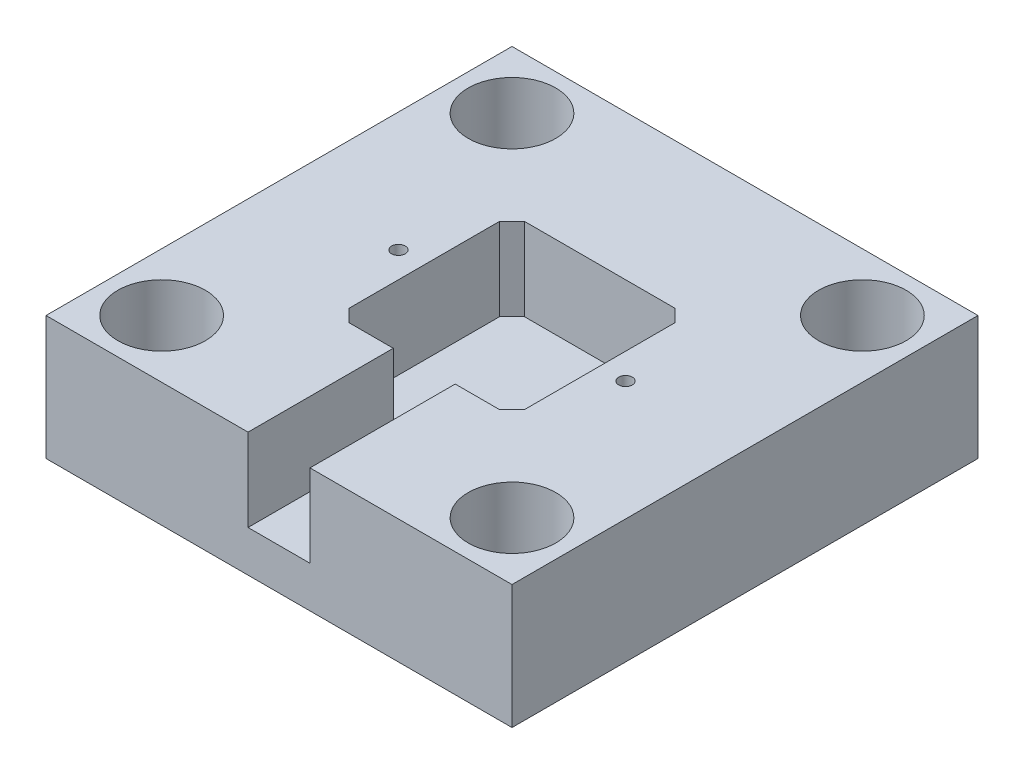
ISO-10303-21;
HEADER;
FILE_DESCRIPTION(('STEP AP214'),'2;1');
FILE_NAME('part.step','',(''),(''),'','','');
FILE_SCHEMA(('AUTOMOTIVE_DESIGN { 1 0 10303 214 1 1 1 1 }'));
ENDSEC;
DATA;
#1=APPLICATION_CONTEXT('core data for automotive mechanical design processes');
#2=APPLICATION_PROTOCOL_DEFINITION('international standard','automotive_design',2000,#1);
#3=PRODUCT_CONTEXT('',#1,'mechanical');
#4=PRODUCT('Part','Part','',(#3));
#5=PRODUCT_RELATED_PRODUCT_CATEGORY('part','',(#4));
#6=PRODUCT_DEFINITION_FORMATION('','',#4);
#7=PRODUCT_DEFINITION_CONTEXT('part definition',#1,'design');
#8=PRODUCT_DEFINITION('design','',#6,#7);
#9=PRODUCT_DEFINITION_SHAPE('','',#8);
#10=(LENGTH_UNIT() NAMED_UNIT(*) SI_UNIT(.MILLI.,.METRE.));
#11=(NAMED_UNIT(*) PLANE_ANGLE_UNIT() SI_UNIT($,.RADIAN.));
#12=(NAMED_UNIT(*) SI_UNIT($,.STERADIAN.) SOLID_ANGLE_UNIT());
#13=UNCERTAINTY_MEASURE_WITH_UNIT(LENGTH_MEASURE(1.E-05),#10,'distance_accuracy_value','');
#14=(GEOMETRIC_REPRESENTATION_CONTEXT(3) GLOBAL_UNCERTAINTY_ASSIGNED_CONTEXT((#13)) GLOBAL_UNIT_ASSIGNED_CONTEXT((#10,
#11,#12)) REPRESENTATION_CONTEXT('',''));
#15=CARTESIAN_POINT('',(0.,0.,0.));
#16=DIRECTION('',(0.,0.,1.));
#17=DIRECTION('',(1.,0.,0.));
#18=AXIS2_PLACEMENT_3D('',#15,#16,#17);
#19=CARTESIAN_POINT('',(0.,125.,0.));
#20=DIRECTION('',(0.,-1.,0.));
#21=DIRECTION('',(0.,0.,-1.));
#22=AXIS2_PLACEMENT_3D('',#19,#20,#21);
#23=PLANE('',#22);
#24=CARTESIAN_POINT('',(-27.5,125.,0.));
#25=DIRECTION('',(0.,-1.,0.));
#26=DIRECTION('',(0.,0.,-1.));
#27=AXIS2_PLACEMENT_3D('',#24,#25,#26);
#28=CIRCLE('',#27,1.65);
#29=CARTESIAN_POINT('',(-27.5,125.,-1.65));
#30=VERTEX_POINT('',#29);
#31=EDGE_CURVE('E272',#30,#30,#28,.T.);
#32=ORIENTED_EDGE('',*,*,#31,.T.);
#33=EDGE_LOOP('',(#32));
#34=FACE_BOUND('',#33,.T.);
#35=CARTESIAN_POINT('',(27.5,125.,0.));
#36=DIRECTION('',(0.,-1.,0.));
#37=DIRECTION('',(0.,0.,-1.));
#38=AXIS2_PLACEMENT_3D('',#35,#36,#37);
#39=CIRCLE('',#38,1.65);
#40=CARTESIAN_POINT('',(27.5,125.,-1.65));
#41=VERTEX_POINT('',#40);
#42=EDGE_CURVE('E269',#41,#41,#39,.T.);
#43=ORIENTED_EDGE('',*,*,#42,.T.);
#44=EDGE_LOOP('',(#43));
#45=FACE_BOUND('',#44,.T.);
#46=DIRECTION('',(1.,0.,0.));
#47=VECTOR('',#46,1.);
#48=CARTESIAN_POINT('',(0.,125.,21.25));
#49=LINE('',#48,#47);
#50=CARTESIAN_POINT('',(7.5,125.,21.25));
#51=VERTEX_POINT('',#50);
#52=CARTESIAN_POINT('',(18.25,125.,21.25));
#53=VERTEX_POINT('',#52);
#54=EDGE_CURVE('E196',#51,#53,#49,.T.);
#55=ORIENTED_EDGE('',*,*,#54,.F.);
#56=DIRECTION('',(0.,0.,-1.));
#57=VECTOR('',#56,1.);
#58=CARTESIAN_POINT('',(7.49999999999999,125.,0.));
#59=LINE('',#58,#57);
#60=CARTESIAN_POINT('',(7.5,125.,56.4264068711928));
#61=VERTEX_POINT('',#60);
#62=EDGE_CURVE('E198',#61,#51,#59,.T.);
#63=ORIENTED_EDGE('',*,*,#62,.F.);
#64=DIRECTION('',(1.,0.,0.));
#65=VECTOR('',#64,1.);
#66=CARTESIAN_POINT('',(-56.4264068711929,125.,56.4264068711928));
#67=LINE('',#66,#65);
#68=CARTESIAN_POINT('',(56.4264068711928,125.,56.4264068711928));
#69=VERTEX_POINT('',#68);
#70=EDGE_CURVE('E242',#61,#69,#67,.T.);
#71=ORIENTED_EDGE('',*,*,#70,.T.);
#72=DIRECTION('',(0.,0.,-1.));
#73=VECTOR('',#72,1.);
#74=CARTESIAN_POINT('',(56.4264068711928,125.,-56.4264068711928));
#75=LINE('',#74,#73);
#76=CARTESIAN_POINT('',(56.4264068711928,125.,-56.4264068711928));
#77=VERTEX_POINT('',#76);
#78=EDGE_CURVE('E241',#69,#77,#75,.T.);
#79=ORIENTED_EDGE('',*,*,#78,.T.);
#80=DIRECTION('',(-1.,0.,0.));
#81=VECTOR('',#80,1.);
#82=CARTESIAN_POINT('',(-56.4264068711929,125.,-56.4264068711928));
#83=LINE('',#82,#81);
#84=CARTESIAN_POINT('',(-56.4264068711929,125.,-56.4264068711928));
#85=VERTEX_POINT('',#84);
#86=EDGE_CURVE('E244',#77,#85,#83,.T.);
#87=ORIENTED_EDGE('',*,*,#86,.T.);
#88=DIRECTION('',(0.,0.,1.));
#89=VECTOR('',#88,1.);
#90=CARTESIAN_POINT('',(-56.4264068711929,125.,-56.4264068711928));
#91=LINE('',#90,#89);
#92=CARTESIAN_POINT('',(-56.4264068711929,125.,56.4264068711928));
#93=VERTEX_POINT('',#92);
#94=EDGE_CURVE('E246',#85,#93,#91,.T.);
#95=ORIENTED_EDGE('',*,*,#94,.T.);
#96=CARTESIAN_POINT('',(-7.5,125.,56.4264068711928));
#97=VERTEX_POINT('',#96);
#98=EDGE_CURVE('E238',#93,#97,#67,.T.);
#99=ORIENTED_EDGE('',*,*,#98,.T.);
#100=DIRECTION('',(0.,0.,1.));
#101=VECTOR('',#100,1.);
#102=CARTESIAN_POINT('',(-7.50000000000001,125.,0.));
#103=LINE('',#102,#101);
#104=CARTESIAN_POINT('',(-7.5,125.,21.25));
#105=VERTEX_POINT('',#104);
#106=EDGE_CURVE('E194',#105,#97,#103,.T.);
#107=ORIENTED_EDGE('',*,*,#106,.F.);
#108=CARTESIAN_POINT('',(-18.25,125.,21.25));
#109=VERTEX_POINT('',#108);
#110=EDGE_CURVE('E169',#109,#105,#49,.T.);
#111=ORIENTED_EDGE('',*,*,#110,.F.);
#112=DIRECTION('',(0.707106781186551,0.,0.707106781186544));
#113=VECTOR('',#112,1.);
#114=CARTESIAN_POINT('',(-19.7499999999999,125.,19.7500000000001));
#115=LINE('',#114,#113);
#116=CARTESIAN_POINT('',(-21.25,125.,18.25));
#117=VERTEX_POINT('',#116);
#118=EDGE_CURVE('E301',#109,#117,#115,.F.);
#119=ORIENTED_EDGE('',*,*,#118,.T.);
#120=DIRECTION('',(0.,0.,1.));
#121=VECTOR('',#120,1.);
#122=CARTESIAN_POINT('',(-21.25,125.,0.));
#123=LINE('',#122,#121);
#124=CARTESIAN_POINT('',(-21.25,125.,-18.25));
#125=VERTEX_POINT('',#124);
#126=EDGE_CURVE('E162',#125,#117,#123,.T.);
#127=ORIENTED_EDGE('',*,*,#126,.F.);
#128=DIRECTION('',(0.707106781186544,0.,-0.707106781186551));
#129=VECTOR('',#128,1.);
#130=CARTESIAN_POINT('',(-19.7500000000001,125.,-19.7499999999999));
#131=LINE('',#130,#129);
#132=CARTESIAN_POINT('',(-18.25,125.,-21.25));
#133=VERTEX_POINT('',#132);
#134=EDGE_CURVE('E12',#125,#133,#131,.T.);
#135=ORIENTED_EDGE('',*,*,#134,.T.);
#136=DIRECTION('',(1.,0.,0.));
#137=VECTOR('',#136,1.);
#138=CARTESIAN_POINT('',(0.,125.,-21.25));
#139=LINE('',#138,#137);
#140=CARTESIAN_POINT('',(18.25,125.,-21.25));
#141=VERTEX_POINT('',#140);
#142=EDGE_CURVE('E204',#133,#141,#139,.T.);
#143=ORIENTED_EDGE('',*,*,#142,.T.);
#144=DIRECTION('',(-0.707106781186551,0.,-0.707106781186544));
#145=VECTOR('',#144,1.);
#146=CARTESIAN_POINT('',(19.7499999999999,125.,-19.7500000000001));
#147=LINE('',#146,#145);
#148=CARTESIAN_POINT('',(21.25,125.,-18.25));
#149=VERTEX_POINT('',#148);
#150=EDGE_CURVE('E46',#141,#149,#147,.F.);
#151=ORIENTED_EDGE('',*,*,#150,.T.);
#152=DIRECTION('',(0.,0.,1.));
#153=VECTOR('',#152,1.);
#154=CARTESIAN_POINT('',(21.25,125.,0.));
#155=LINE('',#154,#153);
#156=CARTESIAN_POINT('',(21.25,125.,18.25));
#157=VERTEX_POINT('',#156);
#158=EDGE_CURVE('E201',#149,#157,#155,.T.);
#159=ORIENTED_EDGE('',*,*,#158,.T.);
#160=DIRECTION('',(-0.707106781186544,0.,0.707106781186551));
#161=VECTOR('',#160,1.);
#162=CARTESIAN_POINT('',(19.7500000000001,125.,19.7499999999999));
#163=LINE('',#162,#161);
#164=EDGE_CURVE('E303',#157,#53,#163,.T.);
#165=ORIENTED_EDGE('',*,*,#164,.T.);
#166=EDGE_LOOP('',(#55,#63,#71,#79,#87,#95,#99,#107,#111,#119,#127,#135,#143,#151,#159,#165));
#167=FACE_BOUND('',#166,.T.);
#168=CARTESIAN_POINT('',(42.4264068711929,125.,42.4264068711929));
#169=DIRECTION('',(0.,1.,0.));
#170=DIRECTION('',(0.,0.,1.));
#171=AXIS2_PLACEMENT_3D('',#168,#169,#170);
#172=CIRCLE('',#171,10.6);
#173=CARTESIAN_POINT('',(42.4264068711929,125.,53.0264068711928));
#174=VERTEX_POINT('',#173);
#175=EDGE_CURVE('E232',#174,#174,#172,.T.);
#176=ORIENTED_EDGE('',*,*,#175,.F.);
#177=EDGE_LOOP('',(#176));
#178=FACE_BOUND('',#177,.T.);
#179=CARTESIAN_POINT('',(42.4264068711929,125.,-42.4264068711928));
#180=DIRECTION('',(0.,1.,0.));
#181=DIRECTION('',(0.,0.,1.));
#182=AXIS2_PLACEMENT_3D('',#179,#180,#181);
#183=CIRCLE('',#182,10.6);
#184=CARTESIAN_POINT('',(42.4264068711929,125.,-31.8264068711928));
#185=VERTEX_POINT('',#184);
#186=EDGE_CURVE('E226',#185,#185,#183,.T.);
#187=ORIENTED_EDGE('',*,*,#186,.F.);
#188=EDGE_LOOP('',(#187));
#189=FACE_BOUND('',#188,.T.);
#190=CARTESIAN_POINT('',(-42.4264068711929,125.,42.4264068711929));
#191=DIRECTION('',(0.,1.,0.));
#192=DIRECTION('',(0.,0.,1.));
#193=AXIS2_PLACEMENT_3D('',#190,#191,#192);
#194=CIRCLE('',#193,10.6);
#195=CARTESIAN_POINT('',(-42.4264068711929,125.,53.0264068711929));
#196=VERTEX_POINT('',#195);
#197=EDGE_CURVE('E220',#196,#196,#194,.T.);
#198=ORIENTED_EDGE('',*,*,#197,.F.);
#199=EDGE_LOOP('',(#198));
#200=FACE_BOUND('',#199,.T.);
#201=CARTESIAN_POINT('',(-42.4264068711928,125.,-42.4264068711929));
#202=DIRECTION('',(0.,1.,0.));
#203=DIRECTION('',(0.,0.,1.));
#204=AXIS2_PLACEMENT_3D('',#201,#202,#203);
#205=CIRCLE('',#204,10.6);
#206=CARTESIAN_POINT('',(-42.4264068711928,125.,-31.8264068711929));
#207=VERTEX_POINT('',#206);
#208=EDGE_CURVE('E214',#207,#207,#205,.T.);
#209=ORIENTED_EDGE('',*,*,#208,.F.);
#210=EDGE_LOOP('',(#209));
#211=FACE_BOUND('',#210,.T.);
#212=ADVANCED_FACE('F37',(#34,#45,#167,#178,#189,#200,#211),#23,.F.);
#213=CARTESIAN_POINT('',(0.,95.,0.));
#214=DIRECTION('',(0.,-1.,0.));
#215=DIRECTION('',(0.,0.,-1.));
#216=AXIS2_PLACEMENT_3D('',#213,#214,#215);
#217=PLANE('',#216);
#218=CARTESIAN_POINT('',(0.,95.,0.));
#219=DIRECTION('',(0.,-1.,0.));
#220=DIRECTION('',(0.,0.,-1.));
#221=AXIS2_PLACEMENT_3D('',#218,#219,#220);
#222=CIRCLE('',#221,22.5);
#223=CARTESIAN_POINT('',(0.,95.,-22.5));
#224=VERTEX_POINT('',#223);
#225=EDGE_CURVE('E276',#224,#224,#222,.T.);
#226=ORIENTED_EDGE('',*,*,#225,.F.);
#227=EDGE_LOOP('',(#226));
#228=FACE_BOUND('',#227,.T.);
#229=CARTESIAN_POINT('',(-42.4264068711929,95.,42.4264068711929));
#230=DIRECTION('',(0.,1.,0.));
#231=DIRECTION('',(0.,0.,1.));
#232=AXIS2_PLACEMENT_3D('',#229,#230,#231);
#233=CIRCLE('',#232,10.6);
#234=CARTESIAN_POINT('',(-42.4264068711929,95.,53.0264068711929));
#235=VERTEX_POINT('',#234);
#236=EDGE_CURVE('E217',#235,#235,#233,.T.);
#237=ORIENTED_EDGE('',*,*,#236,.T.);
#238=EDGE_LOOP('',(#237));
#239=FACE_BOUND('',#238,.T.);
#240=CARTESIAN_POINT('',(42.4264068711929,95.,42.4264068711929));
#241=DIRECTION('',(0.,1.,0.));
#242=DIRECTION('',(0.,0.,1.));
#243=AXIS2_PLACEMENT_3D('',#240,#241,#242);
#244=CIRCLE('',#243,10.6);
#245=CARTESIAN_POINT('',(42.4264068711929,95.,53.0264068711928));
#246=VERTEX_POINT('',#245);
#247=EDGE_CURVE('E229',#246,#246,#244,.T.);
#248=ORIENTED_EDGE('',*,*,#247,.T.);
#249=EDGE_LOOP('',(#248));
#250=FACE_BOUND('',#249,.T.);
#251=DIRECTION('',(1.,0.,0.));
#252=VECTOR('',#251,1.);
#253=CARTESIAN_POINT('',(-56.4264068711929,95.,56.4264068711928));
#254=LINE('',#253,#252);
#255=CARTESIAN_POINT('',(-56.4264068711929,95.,56.4264068711928));
#256=VERTEX_POINT('',#255);
#257=CARTESIAN_POINT('',(56.4264068711928,95.,56.4264068711928));
#258=VERTEX_POINT('',#257);
#259=EDGE_CURVE('E235',#256,#258,#254,.T.);
#260=ORIENTED_EDGE('',*,*,#259,.F.);
#261=DIRECTION('',(0.,0.,1.));
#262=VECTOR('',#261,1.);
#263=CARTESIAN_POINT('',(-56.4264068711929,95.,-56.4264068711928));
#264=LINE('',#263,#262);
#265=CARTESIAN_POINT('',(-56.4264068711929,95.,-56.4264068711928));
#266=VERTEX_POINT('',#265);
#267=EDGE_CURVE('E255',#266,#256,#264,.T.);
#268=ORIENTED_EDGE('',*,*,#267,.F.);
#269=DIRECTION('',(-1.,0.,0.));
#270=VECTOR('',#269,1.);
#271=CARTESIAN_POINT('',(-56.4264068711929,95.,-56.4264068711928));
#272=LINE('',#271,#270);
#273=CARTESIAN_POINT('',(56.4264068711928,95.,-56.4264068711928));
#274=VERTEX_POINT('',#273);
#275=EDGE_CURVE('E253',#274,#266,#272,.T.);
#276=ORIENTED_EDGE('',*,*,#275,.F.);
#277=DIRECTION('',(0.,0.,-1.));
#278=VECTOR('',#277,1.);
#279=CARTESIAN_POINT('',(56.4264068711928,95.,-56.4264068711928));
#280=LINE('',#279,#278);
#281=EDGE_CURVE('E251',#258,#274,#280,.T.);
#282=ORIENTED_EDGE('',*,*,#281,.F.);
#283=EDGE_LOOP('',(#260,#268,#276,#282));
#284=FACE_BOUND('',#283,.T.);
#285=CARTESIAN_POINT('',(42.4264068711929,95.,-42.4264068711928));
#286=DIRECTION('',(0.,1.,0.));
#287=DIRECTION('',(0.,0.,1.));
#288=AXIS2_PLACEMENT_3D('',#285,#286,#287);
#289=CIRCLE('',#288,10.6);
#290=CARTESIAN_POINT('',(42.4264068711929,95.,-31.8264068711928));
#291=VERTEX_POINT('',#290);
#292=EDGE_CURVE('E223',#291,#291,#289,.T.);
#293=ORIENTED_EDGE('',*,*,#292,.T.);
#294=EDGE_LOOP('',(#293));
#295=FACE_BOUND('',#294,.T.);
#296=CARTESIAN_POINT('',(-42.4264068711928,95.,-42.4264068711929));
#297=DIRECTION('',(0.,1.,0.));
#298=DIRECTION('',(0.,0.,1.));
#299=AXIS2_PLACEMENT_3D('',#296,#297,#298);
#300=CIRCLE('',#299,10.6);
#301=CARTESIAN_POINT('',(-42.4264068711928,95.,-31.8264068711929));
#302=VERTEX_POINT('',#301);
#303=EDGE_CURVE('E210',#302,#302,#300,.T.);
#304=ORIENTED_EDGE('',*,*,#303,.T.);
#305=EDGE_LOOP('',(#304));
#306=FACE_BOUND('',#305,.T.);
#307=ADVANCED_FACE('F360',(#228,#239,#250,#284,#295,#306),#217,.T.);
#308=CARTESIAN_POINT('',(-56.4264068711929,125.,56.4264068711928));
#309=DIRECTION('',(0.,0.,-1.));
#310=DIRECTION('',(-1.,0.,0.));
#311=AXIS2_PLACEMENT_3D('',#308,#309,#310);
#312=PLANE('',#311);
#313=ORIENTED_EDGE('',*,*,#70,.F.);
#314=DIRECTION('',(0.,1.,0.));
#315=VECTOR('',#314,1.);
#316=CARTESIAN_POINT('',(7.5,105.,56.4264068711928));
#317=LINE('',#316,#315);
#318=CARTESIAN_POINT('',(7.5,105.,56.4264068711928));
#319=VERTEX_POINT('',#318);
#320=EDGE_CURVE('E211',#319,#61,#317,.T.);
#321=ORIENTED_EDGE('',*,*,#320,.F.);
#322=DIRECTION('',(1.,0.,0.));
#323=VECTOR('',#322,1.);
#324=CARTESIAN_POINT('',(0.,105.,56.4264068711928));
#325=LINE('',#324,#323);
#326=CARTESIAN_POINT('',(-7.50000000000001,105.,56.4264068711928));
#327=VERTEX_POINT('',#326);
#328=EDGE_CURVE('E178',#327,#319,#325,.T.);
#329=ORIENTED_EDGE('',*,*,#328,.F.);
#330=DIRECTION('',(0.,1.,0.));
#331=VECTOR('',#330,1.);
#332=CARTESIAN_POINT('',(-7.5,105.,56.4264068711928));
#333=LINE('',#332,#331);
#334=EDGE_CURVE('E172',#327,#97,#333,.T.);
#335=ORIENTED_EDGE('',*,*,#334,.T.);
#336=ORIENTED_EDGE('',*,*,#98,.F.);
#337=DIRECTION('',(0.,-1.,0.));
#338=VECTOR('',#337,1.);
#339=CARTESIAN_POINT('',(-56.4264068711929,125.,56.4264068711928));
#340=LINE('',#339,#338);
#341=EDGE_CURVE('E248',#93,#256,#340,.T.);
#342=ORIENTED_EDGE('',*,*,#341,.T.);
#343=ORIENTED_EDGE('',*,*,#259,.T.);
#344=DIRECTION('',(0.,-1.,0.));
#345=VECTOR('',#344,1.);
#346=CARTESIAN_POINT('',(56.4264068711928,125.,56.4264068711928));
#347=LINE('',#346,#345);
#348=EDGE_CURVE('E265',#69,#258,#347,.T.);
#349=ORIENTED_EDGE('',*,*,#348,.F.);
#350=EDGE_LOOP('',(#313,#321,#329,#335,#336,#342,#343,#349));
#351=FACE_BOUND('',#350,.T.);
#352=ADVANCED_FACE('F329',(#351),#312,.F.);
#353=CARTESIAN_POINT('',(56.4264068711928,125.,-56.4264068711928));
#354=DIRECTION('',(-1.,0.,0.));
#355=DIRECTION('',(0.,0.,1.));
#356=AXIS2_PLACEMENT_3D('',#353,#354,#355);
#357=PLANE('',#356);
#358=ORIENTED_EDGE('',*,*,#281,.T.);
#359=DIRECTION('',(0.,-1.,0.));
#360=VECTOR('',#359,1.);
#361=CARTESIAN_POINT('',(56.4264068711928,125.,-56.4264068711928));
#362=LINE('',#361,#360);
#363=EDGE_CURVE('E262',#77,#274,#362,.T.);
#364=ORIENTED_EDGE('',*,*,#363,.F.);
#365=ORIENTED_EDGE('',*,*,#78,.F.);
#366=ORIENTED_EDGE('',*,*,#348,.T.);
#367=EDGE_LOOP('',(#358,#364,#365,#366));
#368=FACE_BOUND('',#367,.T.);
#369=ADVANCED_FACE('F347',(#368),#357,.F.);
#370=CARTESIAN_POINT('',(-56.4264068711929,125.,-56.4264068711928));
#371=DIRECTION('',(0.,0.,1.));
#372=DIRECTION('',(1.,0.,0.));
#373=AXIS2_PLACEMENT_3D('',#370,#371,#372);
#374=PLANE('',#373);
#375=ORIENTED_EDGE('',*,*,#275,.T.);
#376=DIRECTION('',(0.,-1.,0.));
#377=VECTOR('',#376,1.);
#378=CARTESIAN_POINT('',(-56.4264068711929,125.,-56.4264068711928));
#379=LINE('',#378,#377);
#380=EDGE_CURVE('E259',#85,#266,#379,.T.);
#381=ORIENTED_EDGE('',*,*,#380,.F.);
#382=ORIENTED_EDGE('',*,*,#86,.F.);
#383=ORIENTED_EDGE('',*,*,#363,.T.);
#384=EDGE_LOOP('',(#375,#381,#382,#383));
#385=FACE_BOUND('',#384,.T.);
#386=ADVANCED_FACE('F354',(#385),#374,.F.);
#387=CARTESIAN_POINT('',(-56.4264068711929,125.,-56.4264068711928));
#388=DIRECTION('',(1.,0.,0.));
#389=DIRECTION('',(0.,0.,-1.));
#390=AXIS2_PLACEMENT_3D('',#387,#388,#389);
#391=PLANE('',#390);
#392=ORIENTED_EDGE('',*,*,#267,.T.);
#393=ORIENTED_EDGE('',*,*,#341,.F.);
#394=ORIENTED_EDGE('',*,*,#94,.F.);
#395=ORIENTED_EDGE('',*,*,#380,.T.);
#396=EDGE_LOOP('',(#392,#393,#394,#395));
#397=FACE_BOUND('',#396,.T.);
#398=ADVANCED_FACE('F358',(#397),#391,.F.);
#399=CARTESIAN_POINT('',(42.4264068711929,125.,42.4264068711929));
#400=DIRECTION('',(0.,-1.,0.));
#401=DIRECTION('',(0.,0.,-1.));
#402=AXIS2_PLACEMENT_3D('',#399,#400,#401);
#403=CYLINDRICAL_SURFACE('',#402,10.6);
#404=ORIENTED_EDGE('',*,*,#175,.T.);
#405=EDGE_LOOP('',(#404));
#406=FACE_BOUND('',#405,.T.);
#407=ORIENTED_EDGE('',*,*,#247,.F.);
#408=EDGE_LOOP('',(#407));
#409=FACE_BOUND('',#408,.T.);
#410=ADVANCED_FACE('F390',(#406,#409),#403,.F.);
#411=CARTESIAN_POINT('',(42.4264068711929,125.,-42.4264068711928));
#412=DIRECTION('',(0.,-1.,0.));
#413=DIRECTION('',(0.,0.,-1.));
#414=AXIS2_PLACEMENT_3D('',#411,#412,#413);
#415=CYLINDRICAL_SURFACE('',#414,10.6);
#416=ORIENTED_EDGE('',*,*,#186,.T.);
#417=EDGE_LOOP('',(#416));
#418=FACE_BOUND('',#417,.T.);
#419=ORIENTED_EDGE('',*,*,#292,.F.);
#420=EDGE_LOOP('',(#419));
#421=FACE_BOUND('',#420,.T.);
#422=ADVANCED_FACE('F379',(#418,#421),#415,.F.);
#423=CARTESIAN_POINT('',(-42.4264068711929,125.,42.4264068711929));
#424=DIRECTION('',(0.,-1.,0.));
#425=DIRECTION('',(0.,0.,-1.));
#426=AXIS2_PLACEMENT_3D('',#423,#424,#425);
#427=CYLINDRICAL_SURFACE('',#426,10.6);
#428=ORIENTED_EDGE('',*,*,#197,.T.);
#429=EDGE_LOOP('',(#428));
#430=FACE_BOUND('',#429,.T.);
#431=ORIENTED_EDGE('',*,*,#236,.F.);
#432=EDGE_LOOP('',(#431));
#433=FACE_BOUND('',#432,.T.);
#434=ADVANCED_FACE('F371',(#430,#433),#427,.F.);
#435=CARTESIAN_POINT('',(-42.4264068711928,125.,-42.4264068711929));
#436=DIRECTION('',(0.,-1.,0.));
#437=DIRECTION('',(0.,0.,-1.));
#438=AXIS2_PLACEMENT_3D('',#435,#436,#437);
#439=CYLINDRICAL_SURFACE('',#438,10.6);
#440=ORIENTED_EDGE('',*,*,#208,.T.);
#441=EDGE_LOOP('',(#440));
#442=FACE_BOUND('',#441,.T.);
#443=ORIENTED_EDGE('',*,*,#303,.F.);
#444=EDGE_LOOP('',(#443));
#445=FACE_BOUND('',#444,.T.);
#446=ADVANCED_FACE('F369',(#442,#445),#439,.F.);
#447=CARTESIAN_POINT('',(0.,105.,21.25));
#448=DIRECTION('',(0.,0.,1.));
#449=DIRECTION('',(1.,0.,0.));
#450=AXIS2_PLACEMENT_3D('',#447,#448,#449);
#451=PLANE('',#450);
#452=DIRECTION('',(1.,0.,0.));
#453=VECTOR('',#452,1.);
#454=CARTESIAN_POINT('',(0.,105.,21.25));
#455=LINE('',#454,#453);
#456=CARTESIAN_POINT('',(-18.25,105.,21.25));
#457=VERTEX_POINT('',#456);
#458=CARTESIAN_POINT('',(-7.5,105.,21.25));
#459=VERTEX_POINT('',#458);
#460=EDGE_CURVE('E149',#457,#459,#455,.T.);
#461=ORIENTED_EDGE('',*,*,#460,.F.);
#462=DIRECTION('',(0.,1.,0.));
#463=VECTOR('',#462,1.);
#464=CARTESIAN_POINT('',(-18.25,125.,21.25));
#465=LINE('',#464,#463);
#466=EDGE_CURVE('E268',#457,#109,#465,.T.);
#467=ORIENTED_EDGE('',*,*,#466,.T.);
#468=ORIENTED_EDGE('',*,*,#110,.T.);
#469=DIRECTION('',(0.,1.,0.));
#470=VECTOR('',#469,1.);
#471=CARTESIAN_POINT('',(-7.5,105.,21.25));
#472=LINE('',#471,#470);
#473=EDGE_CURVE('E166',#459,#105,#472,.T.);
#474=ORIENTED_EDGE('',*,*,#473,.F.);
#475=EDGE_LOOP('',(#461,#467,#468,#474));
#476=FACE_BOUND('',#475,.T.);
#477=ADVANCED_FACE('F167',(#476),#451,.F.);
#478=CARTESIAN_POINT('',(-21.25,105.,0.));
#479=DIRECTION('',(-1.,0.,0.));
#480=DIRECTION('',(0.,0.,1.));
#481=AXIS2_PLACEMENT_3D('',#478,#479,#480);
#482=PLANE('',#481);
#483=ORIENTED_EDGE('',*,*,#126,.T.);
#484=DIRECTION('',(0.,-1.,0.));
#485=VECTOR('',#484,1.);
#486=CARTESIAN_POINT('',(-21.25,105.,18.25));
#487=LINE('',#486,#485);
#488=CARTESIAN_POINT('',(-21.25,105.,18.25));
#489=VERTEX_POINT('',#488);
#490=EDGE_CURVE('E281',#117,#489,#487,.T.);
#491=ORIENTED_EDGE('',*,*,#490,.T.);
#492=DIRECTION('',(0.,0.,1.));
#493=VECTOR('',#492,1.);
#494=CARTESIAN_POINT('',(-21.25,105.,0.));
#495=LINE('',#494,#493);
#496=CARTESIAN_POINT('',(-21.25,105.,-18.25));
#497=VERTEX_POINT('',#496);
#498=EDGE_CURVE('E173',#497,#489,#495,.T.);
#499=ORIENTED_EDGE('',*,*,#498,.F.);
#500=DIRECTION('',(0.,1.,0.));
#501=VECTOR('',#500,1.);
#502=CARTESIAN_POINT('',(-21.25,105.,-18.25));
#503=LINE('',#502,#501);
#504=EDGE_CURVE('E278',#497,#125,#503,.T.);
#505=ORIENTED_EDGE('',*,*,#504,.T.);
#506=EDGE_LOOP('',(#483,#491,#499,#505));
#507=FACE_BOUND('',#506,.T.);
#508=ADVANCED_FACE('F322',(#507),#482,.F.);
#509=CARTESIAN_POINT('',(0.,105.,-21.25));
#510=DIRECTION('',(0.,0.,1.));
#511=DIRECTION('',(1.,0.,0.));
#512=AXIS2_PLACEMENT_3D('',#509,#510,#511);
#513=PLANE('',#512);
#514=DIRECTION('',(1.,0.,0.));
#515=VECTOR('',#514,1.);
#516=CARTESIAN_POINT('',(0.,105.,-21.25));
#517=LINE('',#516,#515);
#518=CARTESIAN_POINT('',(-18.25,105.,-21.25));
#519=VERTEX_POINT('',#518);
#520=CARTESIAN_POINT('',(18.25,105.,-21.25));
#521=VERTEX_POINT('',#520);
#522=EDGE_CURVE('E189',#519,#521,#517,.T.);
#523=ORIENTED_EDGE('',*,*,#522,.T.);
#524=DIRECTION('',(0.,1.,0.));
#525=VECTOR('',#524,1.);
#526=CARTESIAN_POINT('',(18.25,125.,-21.25));
#527=LINE('',#526,#525);
#528=EDGE_CURVE('E299',#521,#141,#527,.T.);
#529=ORIENTED_EDGE('',*,*,#528,.T.);
#530=ORIENTED_EDGE('',*,*,#142,.F.);
#531=DIRECTION('',(0.,-1.,0.));
#532=VECTOR('',#531,1.);
#533=CARTESIAN_POINT('',(-18.25,105.,-21.25));
#534=LINE('',#533,#532);
#535=EDGE_CURVE('E297',#133,#519,#534,.T.);
#536=ORIENTED_EDGE('',*,*,#535,.T.);
#537=EDGE_LOOP('',(#523,#529,#530,#536));
#538=FACE_BOUND('',#537,.T.);
#539=ADVANCED_FACE('F316',(#538),#513,.T.);
#540=CARTESIAN_POINT('',(21.25,105.,0.));
#541=DIRECTION('',(-1.,0.,0.));
#542=DIRECTION('',(0.,0.,1.));
#543=AXIS2_PLACEMENT_3D('',#540,#541,#542);
#544=PLANE('',#543);
#545=DIRECTION('',(0.,0.,1.));
#546=VECTOR('',#545,1.);
#547=CARTESIAN_POINT('',(21.25,105.,0.));
#548=LINE('',#547,#546);
#549=CARTESIAN_POINT('',(21.25,105.,-18.25));
#550=VERTEX_POINT('',#549);
#551=CARTESIAN_POINT('',(21.25,105.,18.25));
#552=VERTEX_POINT('',#551);
#553=EDGE_CURVE('E186',#550,#552,#548,.T.);
#554=ORIENTED_EDGE('',*,*,#553,.T.);
#555=DIRECTION('',(0.,1.,0.));
#556=VECTOR('',#555,1.);
#557=CARTESIAN_POINT('',(21.25,105.,18.25));
#558=LINE('',#557,#556);
#559=EDGE_CURVE('E292',#552,#157,#558,.T.);
#560=ORIENTED_EDGE('',*,*,#559,.T.);
#561=ORIENTED_EDGE('',*,*,#158,.F.);
#562=DIRECTION('',(0.,-1.,0.));
#563=VECTOR('',#562,1.);
#564=CARTESIAN_POINT('',(21.25,105.,-18.25));
#565=LINE('',#564,#563);
#566=EDGE_CURVE('E290',#149,#550,#565,.T.);
#567=ORIENTED_EDGE('',*,*,#566,.T.);
#568=EDGE_LOOP('',(#554,#560,#561,#567));
#569=FACE_BOUND('',#568,.T.);
#570=ADVANCED_FACE('F308',(#569),#544,.T.);
#571=ORIENTED_EDGE('',*,*,#54,.T.);
#572=DIRECTION('',(0.,-1.,0.));
#573=VECTOR('',#572,1.);
#574=CARTESIAN_POINT('',(18.25,105.,21.25));
#575=LINE('',#574,#573);
#576=CARTESIAN_POINT('',(18.25,105.,21.25));
#577=VERTEX_POINT('',#576);
#578=EDGE_CURVE('E295',#53,#577,#575,.T.);
#579=ORIENTED_EDGE('',*,*,#578,.T.);
#580=CARTESIAN_POINT('',(7.5,105.,21.25));
#581=VERTEX_POINT('',#580);
#582=EDGE_CURVE('E164',#581,#577,#455,.T.);
#583=ORIENTED_EDGE('',*,*,#582,.F.);
#584=DIRECTION('',(0.,1.,0.));
#585=VECTOR('',#584,1.);
#586=CARTESIAN_POINT('',(7.5,105.,21.25));
#587=LINE('',#586,#585);
#588=EDGE_CURVE('E208',#581,#51,#587,.T.);
#589=ORIENTED_EDGE('',*,*,#588,.T.);
#590=EDGE_LOOP('',(#571,#579,#583,#589));
#591=FACE_BOUND('',#590,.T.);
#592=ADVANCED_FACE('F339',(#591),#451,.F.);
#593=CARTESIAN_POINT('',(7.49999999999999,105.,0.));
#594=DIRECTION('',(1.,0.,0.));
#595=DIRECTION('',(0.,0.,-1.));
#596=AXIS2_PLACEMENT_3D('',#593,#594,#595);
#597=PLANE('',#596);
#598=ORIENTED_EDGE('',*,*,#62,.T.);
#599=ORIENTED_EDGE('',*,*,#588,.F.);
#600=DIRECTION('',(0.,0.,-1.));
#601=VECTOR('',#600,1.);
#602=CARTESIAN_POINT('',(7.49999999999999,105.,0.));
#603=LINE('',#602,#601);
#604=EDGE_CURVE('E180',#319,#581,#603,.T.);
#605=ORIENTED_EDGE('',*,*,#604,.F.);
#606=ORIENTED_EDGE('',*,*,#320,.T.);
#607=EDGE_LOOP('',(#598,#599,#605,#606));
#608=FACE_BOUND('',#607,.T.);
#609=ADVANCED_FACE('F335',(#608),#597,.F.);
#610=CARTESIAN_POINT('',(-7.50000000000001,105.,0.));
#611=DIRECTION('',(-1.,0.,0.));
#612=DIRECTION('',(0.,0.,1.));
#613=AXIS2_PLACEMENT_3D('',#610,#611,#612);
#614=PLANE('',#613);
#615=ORIENTED_EDGE('',*,*,#106,.T.);
#616=ORIENTED_EDGE('',*,*,#334,.F.);
#617=DIRECTION('',(0.,0.,1.));
#618=VECTOR('',#617,1.);
#619=CARTESIAN_POINT('',(-7.50000000000001,105.,0.));
#620=LINE('',#619,#618);
#621=EDGE_CURVE('E155',#459,#327,#620,.T.);
#622=ORIENTED_EDGE('',*,*,#621,.F.);
#623=ORIENTED_EDGE('',*,*,#473,.T.);
#624=EDGE_LOOP('',(#615,#616,#622,#623));
#625=FACE_BOUND('',#624,.T.);
#626=ADVANCED_FACE('F175',(#625),#614,.F.);
#627=CARTESIAN_POINT('',(0.,105.,0.));
#628=DIRECTION('',(0.,1.,0.));
#629=DIRECTION('',(0.,0.,1.));
#630=AXIS2_PLACEMENT_3D('',#627,#628,#629);
#631=PLANE('',#630);
#632=ORIENTED_EDGE('',*,*,#498,.T.);
#633=DIRECTION('',(-0.707106781186551,0.,-0.707106781186544));
#634=VECTOR('',#633,1.);
#635=CARTESIAN_POINT('',(-19.7499999999999,105.,19.7500000000001));
#636=LINE('',#635,#634);
#637=EDGE_CURVE('E158',#489,#457,#636,.F.);
#638=ORIENTED_EDGE('',*,*,#637,.T.);
#639=ORIENTED_EDGE('',*,*,#460,.T.);
#640=ORIENTED_EDGE('',*,*,#621,.T.);
#641=ORIENTED_EDGE('',*,*,#328,.T.);
#642=ORIENTED_EDGE('',*,*,#604,.T.);
#643=ORIENTED_EDGE('',*,*,#582,.T.);
#644=DIRECTION('',(0.707106781186544,0.,-0.707106781186551));
#645=VECTOR('',#644,1.);
#646=CARTESIAN_POINT('',(19.7500000000001,105.,19.7499999999999));
#647=LINE('',#646,#645);
#648=EDGE_CURVE('E287',#577,#552,#647,.T.);
#649=ORIENTED_EDGE('',*,*,#648,.T.);
#650=ORIENTED_EDGE('',*,*,#553,.F.);
#651=DIRECTION('',(0.707106781186551,0.,0.707106781186544));
#652=VECTOR('',#651,1.);
#653=CARTESIAN_POINT('',(19.7499999999999,105.,-19.7500000000001));
#654=LINE('',#653,#652);
#655=EDGE_CURVE('E285',#550,#521,#654,.F.);
#656=ORIENTED_EDGE('',*,*,#655,.T.);
#657=ORIENTED_EDGE('',*,*,#522,.F.);
#658=DIRECTION('',(-0.707106781186544,0.,0.707106781186551));
#659=VECTOR('',#658,1.);
#660=CARTESIAN_POINT('',(-19.7500000000001,105.,-19.7499999999999));
#661=LINE('',#660,#659);
#662=EDGE_CURVE('E283',#519,#497,#661,.T.);
#663=ORIENTED_EDGE('',*,*,#662,.T.);
#664=EDGE_LOOP('',(#632,#638,#639,#640,#641,#642,#643,#649,#650,#656,#657,#663));
#665=FACE_BOUND('',#664,.T.);
#666=ADVANCED_FACE('F152',(#665),#631,.T.);
#667=CARTESIAN_POINT('',(0.,85.,0.));
#668=DIRECTION('',(0.,1.,0.));
#669=DIRECTION('',(0.,0.,1.));
#670=AXIS2_PLACEMENT_3D('',#667,#668,#669);
#671=CYLINDRICAL_SURFACE('',#670,22.5);
#672=CARTESIAN_POINT('',(0.,85.,0.));
#673=DIRECTION('',(0.,-1.,0.));
#674=DIRECTION('',(0.,0.,-1.));
#675=AXIS2_PLACEMENT_3D('',#672,#673,#674);
#676=CIRCLE('',#675,22.5);
#677=CARTESIAN_POINT('',(0.,85.,-22.5));
#678=VERTEX_POINT('',#677);
#679=EDGE_CURVE('E195',#678,#678,#676,.T.);
#680=ORIENTED_EDGE('',*,*,#679,.F.);
#681=EDGE_LOOP('',(#680));
#682=FACE_BOUND('',#681,.T.);
#683=ORIENTED_EDGE('',*,*,#225,.T.);
#684=EDGE_LOOP('',(#683));
#685=FACE_BOUND('',#684,.T.);
#686=ADVANCED_FACE('F487',(#682,#685),#671,.T.);
#687=CARTESIAN_POINT('',(0.,85.,0.));
#688=DIRECTION('',(0.,-1.,0.));
#689=DIRECTION('',(0.,0.,-1.));
#690=AXIS2_PLACEMENT_3D('',#687,#688,#689);
#691=PLANE('',#690);
#692=ORIENTED_EDGE('',*,*,#679,.T.);
#693=EDGE_LOOP('',(#692));
#694=FACE_BOUND('',#693,.T.);
#695=ADVANCED_FACE('F477',(#694),#691,.T.);
#696=CARTESIAN_POINT('',(27.5,110.333095244169,0.));
#697=DIRECTION('',(0.,1.,0.));
#698=DIRECTION('',(0.,0.,1.));
#699=AXIS2_PLACEMENT_3D('',#696,#697,#698);
#700=CYLINDRICAL_SURFACE('',#699,1.65);
#701=CARTESIAN_POINT('',(27.5,120.,0.));
#702=DIRECTION('',(0.,-1.,0.));
#703=DIRECTION('',(0.,0.,-1.));
#704=AXIS2_PLACEMENT_3D('',#701,#702,#703);
#705=CIRCLE('',#704,1.65);
#706=CARTESIAN_POINT('',(27.5,120.,-1.65));
#707=VERTEX_POINT('',#706);
#708=EDGE_CURVE('E646',#707,#707,#705,.F.);
#709=ORIENTED_EDGE('',*,*,#708,.F.);
#710=EDGE_LOOP('',(#709));
#711=FACE_BOUND('',#710,.T.);
#712=ORIENTED_EDGE('',*,*,#42,.F.);
#713=EDGE_LOOP('',(#712));
#714=FACE_BOUND('',#713,.T.);
#715=ADVANCED_FACE('F467',(#711,#714),#700,.F.);
#716=CARTESIAN_POINT('',(0.,120.,0.));
#717=DIRECTION('',(0.,-1.,0.));
#718=DIRECTION('',(0.,0.,-1.));
#719=AXIS2_PLACEMENT_3D('',#716,#717,#718);
#720=PLANE('',#719);
#721=ORIENTED_EDGE('',*,*,#708,.T.);
#722=EDGE_LOOP('',(#721));
#723=FACE_BOUND('',#722,.T.);
#724=ADVANCED_FACE('F457',(#723),#720,.F.);
#725=CARTESIAN_POINT('',(-27.5,110.333095244169,0.));
#726=DIRECTION('',(0.,1.,0.));
#727=DIRECTION('',(0.,0.,1.));
#728=AXIS2_PLACEMENT_3D('',#725,#726,#727);
#729=CYLINDRICAL_SURFACE('',#728,1.65);
#730=CARTESIAN_POINT('',(-27.5,120.,0.));
#731=DIRECTION('',(0.,-1.,0.));
#732=DIRECTION('',(0.,0.,-1.));
#733=AXIS2_PLACEMENT_3D('',#730,#731,#732);
#734=CIRCLE('',#733,1.65);
#735=CARTESIAN_POINT('',(-27.5,120.,-1.65));
#736=VERTEX_POINT('',#735);
#737=EDGE_CURVE('E273',#736,#736,#734,.F.);
#738=ORIENTED_EDGE('',*,*,#737,.F.);
#739=EDGE_LOOP('',(#738));
#740=FACE_BOUND('',#739,.T.);
#741=ORIENTED_EDGE('',*,*,#31,.F.);
#742=EDGE_LOOP('',(#741));
#743=FACE_BOUND('',#742,.T.);
#744=ADVANCED_FACE('F447',(#740,#743),#729,.F.);
#745=CARTESIAN_POINT('',(0.,120.,0.));
#746=DIRECTION('',(0.,-1.,0.));
#747=DIRECTION('',(0.,0.,-1.));
#748=AXIS2_PLACEMENT_3D('',#745,#746,#747);
#749=PLANE('',#748);
#750=ORIENTED_EDGE('',*,*,#737,.T.);
#751=EDGE_LOOP('',(#750));
#752=FACE_BOUND('',#751,.T.);
#753=ADVANCED_FACE('F407',(#752),#749,.F.);
#754=CARTESIAN_POINT('',(-18.25,105.,21.25));
#755=DIRECTION('',(0.707106781186544,0.,-0.707106781186551));
#756=DIRECTION('',(0.,-1.,0.));
#757=AXIS2_PLACEMENT_3D('',#754,#755,#756);
#758=PLANE('',#757);
#759=ORIENTED_EDGE('',*,*,#637,.F.);
#760=ORIENTED_EDGE('',*,*,#490,.F.);
#761=ORIENTED_EDGE('',*,*,#118,.F.);
#762=ORIENTED_EDGE('',*,*,#466,.F.);
#763=EDGE_LOOP('',(#759,#760,#761,#762));
#764=FACE_BOUND('',#763,.T.);
#765=ADVANCED_FACE('F325',(#764),#758,.T.);
#766=CARTESIAN_POINT('',(21.25,105.,18.25));
#767=DIRECTION('',(0.707106781186551,0.,0.707106781186544));
#768=DIRECTION('',(0.,1.,0.));
#769=AXIS2_PLACEMENT_3D('',#766,#767,#768);
#770=PLANE('',#769);
#771=ORIENTED_EDGE('',*,*,#648,.F.);
#772=ORIENTED_EDGE('',*,*,#578,.F.);
#773=ORIENTED_EDGE('',*,*,#164,.F.);
#774=ORIENTED_EDGE('',*,*,#559,.F.);
#775=EDGE_LOOP('',(#771,#772,#773,#774));
#776=FACE_BOUND('',#775,.T.);
#777=ADVANCED_FACE('F342',(#776),#770,.F.);
#778=CARTESIAN_POINT('',(18.25,105.,-21.25));
#779=DIRECTION('',(-0.707106781186544,0.,0.707106781186551));
#780=DIRECTION('',(0.,-1.,0.));
#781=AXIS2_PLACEMENT_3D('',#778,#779,#780);
#782=PLANE('',#781);
#783=ORIENTED_EDGE('',*,*,#655,.F.);
#784=ORIENTED_EDGE('',*,*,#566,.F.);
#785=ORIENTED_EDGE('',*,*,#150,.F.);
#786=ORIENTED_EDGE('',*,*,#528,.F.);
#787=EDGE_LOOP('',(#783,#784,#785,#786));
#788=FACE_BOUND('',#787,.T.);
#789=ADVANCED_FACE('F312',(#788),#782,.T.);
#790=CARTESIAN_POINT('',(-21.25,105.,-18.25));
#791=DIRECTION('',(-0.707106781186551,0.,-0.707106781186544));
#792=DIRECTION('',(0.,1.,0.));
#793=AXIS2_PLACEMENT_3D('',#790,#791,#792);
#794=PLANE('',#793);
#795=ORIENTED_EDGE('',*,*,#662,.F.);
#796=ORIENTED_EDGE('',*,*,#535,.F.);
#797=ORIENTED_EDGE('',*,*,#134,.F.);
#798=ORIENTED_EDGE('',*,*,#504,.F.);
#799=EDGE_LOOP('',(#795,#796,#797,#798));
#800=FACE_BOUND('',#799,.T.);
#801=ADVANCED_FACE('F40',(#800),#794,.F.);
#802=CLOSED_SHELL('',(#212,#307,#352,#369,#386,#398,#410,#422,#434,#446,#477,#508,#539,#570,
#592,#609,#626,#666,#686,#695,#715,#724,#744,#753,#765,#777,#789,#801));
#803=MANIFOLD_SOLID_BREP('B2',#802);
#804=ADVANCED_BREP_SHAPE_REPRESENTATION('',(#18,#803),#14);
#805=SHAPE_DEFINITION_REPRESENTATION(#9,#804);
ENDSEC;
END-ISO-10303-21;
